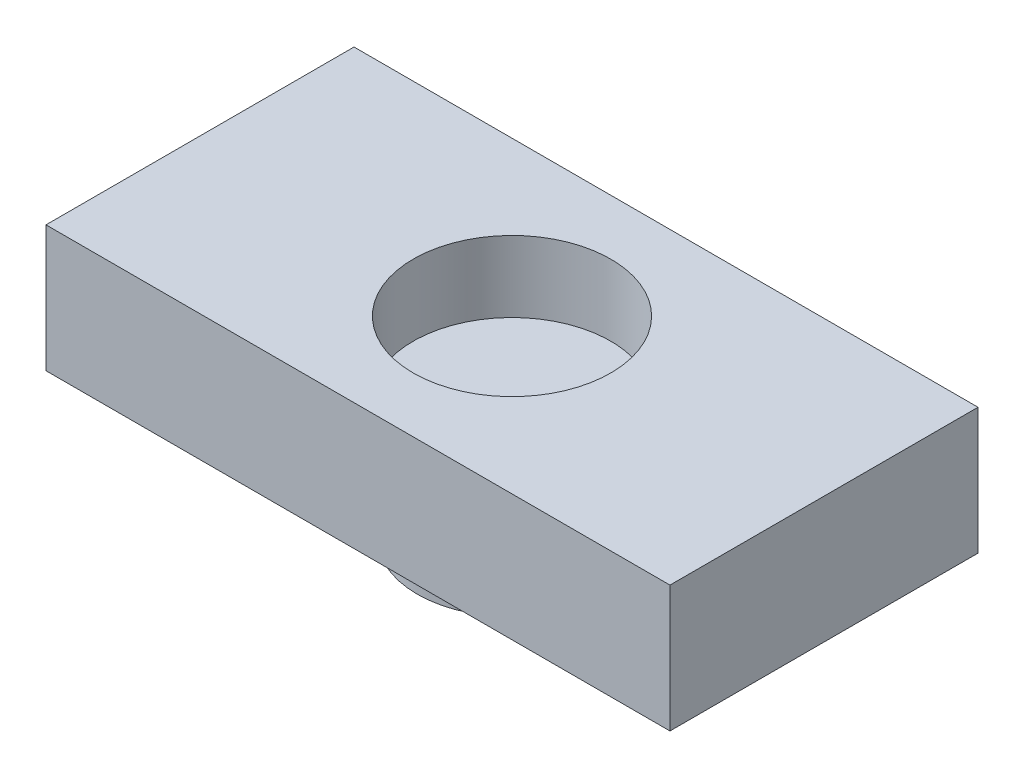
ISO-10303-21;
HEADER;
FILE_DESCRIPTION(('STEP AP214'),'2;1');
FILE_NAME('part.step','',(''),(''),'','','');
FILE_SCHEMA(('AUTOMOTIVE_DESIGN { 1 0 10303 214 1 1 1 1 }'));
ENDSEC;
DATA;
#1=APPLICATION_CONTEXT('core data for automotive mechanical design processes');
#2=APPLICATION_PROTOCOL_DEFINITION('international standard','automotive_design',2000,#1);
#3=PRODUCT_CONTEXT('',#1,'mechanical');
#4=PRODUCT('Part','Part','',(#3));
#5=PRODUCT_RELATED_PRODUCT_CATEGORY('part','',(#4));
#6=PRODUCT_DEFINITION_FORMATION('','',#4);
#7=PRODUCT_DEFINITION_CONTEXT('part definition',#1,'design');
#8=PRODUCT_DEFINITION('design','',#6,#7);
#9=PRODUCT_DEFINITION_SHAPE('','',#8);
#10=(LENGTH_UNIT() NAMED_UNIT(*) SI_UNIT(.MILLI.,.METRE.));
#11=(NAMED_UNIT(*) PLANE_ANGLE_UNIT() SI_UNIT($,.RADIAN.));
#12=(NAMED_UNIT(*) SI_UNIT($,.STERADIAN.) SOLID_ANGLE_UNIT());
#13=UNCERTAINTY_MEASURE_WITH_UNIT(LENGTH_MEASURE(1.E-05),#10,'distance_accuracy_value','');
#14=(GEOMETRIC_REPRESENTATION_CONTEXT(3) GLOBAL_UNCERTAINTY_ASSIGNED_CONTEXT((#13)) GLOBAL_UNIT_ASSIGNED_CONTEXT((#10,
#11,#12)) REPRESENTATION_CONTEXT('',''));
#15=CARTESIAN_POINT('',(0.,0.,0.));
#16=DIRECTION('',(0.,0.,1.));
#17=DIRECTION('',(1.,0.,0.));
#18=AXIS2_PLACEMENT_3D('',#15,#16,#17);
#19=CARTESIAN_POINT('',(-7.9,3.2,0.));
#20=DIRECTION('',(-1.,0.,0.));
#21=DIRECTION('',(0.,0.,1.));
#22=AXIS2_PLACEMENT_3D('',#19,#20,#21);
#23=PLANE('',#22);
#24=DIRECTION('',(0.,0.,-1.));
#25=VECTOR('',#24,1.);
#26=CARTESIAN_POINT('',(-7.9,0.,0.));
#27=LINE('',#26,#25);
#28=CARTESIAN_POINT('',(-7.9,0.,3.9));
#29=VERTEX_POINT('',#28);
#30=CARTESIAN_POINT('',(-7.9,0.,-3.9));
#31=VERTEX_POINT('',#30);
#32=EDGE_CURVE('E156',#29,#31,#27,.T.);
#33=ORIENTED_EDGE('',*,*,#32,.F.);
#34=DIRECTION('',(0.,-1.,0.));
#35=VECTOR('',#34,1.);
#36=CARTESIAN_POINT('',(-7.9,3.2,3.9));
#37=LINE('',#36,#35);
#38=CARTESIAN_POINT('',(-7.9,3.2,3.9));
#39=VERTEX_POINT('',#38);
#40=EDGE_CURVE('E97',#39,#29,#37,.T.);
#41=ORIENTED_EDGE('',*,*,#40,.F.);
#42=DIRECTION('',(0.,0.,-1.));
#43=VECTOR('',#42,1.);
#44=CARTESIAN_POINT('',(-7.9,3.2,0.));
#45=LINE('',#44,#43);
#46=CARTESIAN_POINT('',(-7.9,3.2,-3.9));
#47=VERTEX_POINT('',#46);
#48=EDGE_CURVE('E149',#39,#47,#45,.T.);
#49=ORIENTED_EDGE('',*,*,#48,.T.);
#50=DIRECTION('',(0.,-1.,0.));
#51=VECTOR('',#50,1.);
#52=CARTESIAN_POINT('',(-7.9,3.2,-3.9));
#53=LINE('',#52,#51);
#54=EDGE_CURVE('E128',#47,#31,#53,.T.);
#55=ORIENTED_EDGE('',*,*,#54,.T.);
#56=EDGE_LOOP('',(#33,#41,#49,#55));
#57=FACE_BOUND('',#56,.T.);
#58=ADVANCED_FACE('F89',(#57),#23,.T.);
#59=CARTESIAN_POINT('',(0.,0.,0.));
#60=DIRECTION('',(0.,1.,0.));
#61=DIRECTION('',(0.,0.,1.));
#62=AXIS2_PLACEMENT_3D('',#59,#60,#61);
#63=PLANE('',#62);
#64=CARTESIAN_POINT('',(0.,0.,0.));
#65=DIRECTION('',(0.,1.,0.));
#66=DIRECTION('',(0.,0.,1.));
#67=AXIS2_PLACEMENT_3D('',#64,#65,#66);
#68=CIRCLE('',#67,2.4);
#69=CARTESIAN_POINT('',(0.,0.,2.4));
#70=VERTEX_POINT('',#69);
#71=EDGE_CURVE('E220',#70,#70,#68,.T.);
#72=ORIENTED_EDGE('',*,*,#71,.T.);
#73=EDGE_LOOP('',(#72));
#74=FACE_BOUND('',#73,.T.);
#75=ORIENTED_EDGE('',*,*,#32,.T.);
#76=DIRECTION('',(-1.,0.,0.));
#77=VECTOR('',#76,1.);
#78=CARTESIAN_POINT('',(0.,0.,-3.9));
#79=LINE('',#78,#77);
#80=CARTESIAN_POINT('',(7.9,0.,-3.9));
#81=VERTEX_POINT('',#80);
#82=EDGE_CURVE('E151',#81,#31,#79,.T.);
#83=ORIENTED_EDGE('',*,*,#82,.F.);
#84=DIRECTION('',(0.,0.,-1.));
#85=VECTOR('',#84,1.);
#86=CARTESIAN_POINT('',(7.9,0.,0.));
#87=LINE('',#86,#85);
#88=CARTESIAN_POINT('',(7.9,0.,3.9));
#89=VERTEX_POINT('',#88);
#90=EDGE_CURVE('E121',#89,#81,#87,.T.);
#91=ORIENTED_EDGE('',*,*,#90,.F.);
#92=DIRECTION('',(-1.,0.,0.));
#93=VECTOR('',#92,1.);
#94=CARTESIAN_POINT('',(0.,0.,3.9));
#95=LINE('',#94,#93);
#96=EDGE_CURVE('E142',#89,#29,#95,.T.);
#97=ORIENTED_EDGE('',*,*,#96,.T.);
#98=EDGE_LOOP('',(#75,#83,#91,#97));
#99=FACE_BOUND('',#98,.T.);
#100=ADVANCED_FACE('F166',(#74,#99),#63,.F.);
#101=CARTESIAN_POINT('',(0.,3.2,3.9));
#102=DIRECTION('',(0.,0.,1.));
#103=DIRECTION('',(1.,0.,0.));
#104=AXIS2_PLACEMENT_3D('',#101,#102,#103);
#105=PLANE('',#104);
#106=ORIENTED_EDGE('',*,*,#96,.F.);
#107=DIRECTION('',(0.,-1.,0.));
#108=VECTOR('',#107,1.);
#109=CARTESIAN_POINT('',(7.9,3.2,3.9));
#110=LINE('',#109,#108);
#111=CARTESIAN_POINT('',(7.9,3.2,3.9));
#112=VERTEX_POINT('',#111);
#113=EDGE_CURVE('E136',#112,#89,#110,.T.);
#114=ORIENTED_EDGE('',*,*,#113,.F.);
#115=DIRECTION('',(-1.,0.,0.));
#116=VECTOR('',#115,1.);
#117=CARTESIAN_POINT('',(0.,3.2,3.9));
#118=LINE('',#117,#116);
#119=EDGE_CURVE('E140',#112,#39,#118,.T.);
#120=ORIENTED_EDGE('',*,*,#119,.T.);
#121=ORIENTED_EDGE('',*,*,#40,.T.);
#122=EDGE_LOOP('',(#106,#114,#120,#121));
#123=FACE_BOUND('',#122,.T.);
#124=ADVANCED_FACE('F138',(#123),#105,.T.);
#125=CARTESIAN_POINT('',(7.9,3.2,0.));
#126=DIRECTION('',(-1.,0.,0.));
#127=DIRECTION('',(0.,0.,1.));
#128=AXIS2_PLACEMENT_3D('',#125,#126,#127);
#129=PLANE('',#128);
#130=ORIENTED_EDGE('',*,*,#90,.T.);
#131=DIRECTION('',(0.,-1.,0.));
#132=VECTOR('',#131,1.);
#133=CARTESIAN_POINT('',(7.9,3.2,-3.9));
#134=LINE('',#133,#132);
#135=CARTESIAN_POINT('',(7.9,3.2,-3.9));
#136=VERTEX_POINT('',#135);
#137=EDGE_CURVE('E143',#136,#81,#134,.T.);
#138=ORIENTED_EDGE('',*,*,#137,.F.);
#139=DIRECTION('',(0.,0.,-1.));
#140=VECTOR('',#139,1.);
#141=CARTESIAN_POINT('',(7.9,3.2,0.));
#142=LINE('',#141,#140);
#143=EDGE_CURVE('E145',#112,#136,#142,.T.);
#144=ORIENTED_EDGE('',*,*,#143,.F.);
#145=ORIENTED_EDGE('',*,*,#113,.T.);
#146=EDGE_LOOP('',(#130,#138,#144,#145));
#147=FACE_BOUND('',#146,.T.);
#148=ADVANCED_FACE('F146',(#147),#129,.F.);
#149=CARTESIAN_POINT('',(0.,3.2,-3.9));
#150=DIRECTION('',(0.,0.,1.));
#151=DIRECTION('',(1.,0.,0.));
#152=AXIS2_PLACEMENT_3D('',#149,#150,#151);
#153=PLANE('',#152);
#154=ORIENTED_EDGE('',*,*,#82,.T.);
#155=ORIENTED_EDGE('',*,*,#54,.F.);
#156=DIRECTION('',(-1.,0.,0.));
#157=VECTOR('',#156,1.);
#158=CARTESIAN_POINT('',(0.,3.2,-3.9));
#159=LINE('',#158,#157);
#160=EDGE_CURVE('E105',#136,#47,#159,.T.);
#161=ORIENTED_EDGE('',*,*,#160,.F.);
#162=ORIENTED_EDGE('',*,*,#137,.T.);
#163=EDGE_LOOP('',(#154,#155,#161,#162));
#164=FACE_BOUND('',#163,.T.);
#165=ADVANCED_FACE('F168',(#164),#153,.F.);
#166=CARTESIAN_POINT('',(0.,3.2,0.));
#167=DIRECTION('',(0.,1.,0.));
#168=DIRECTION('',(0.,0.,1.));
#169=AXIS2_PLACEMENT_3D('',#166,#167,#168);
#170=PLANE('',#169);
#171=CARTESIAN_POINT('',(0.,3.2,0.));
#172=DIRECTION('',(0.,1.,0.));
#173=DIRECTION('',(0.,0.,1.));
#174=AXIS2_PLACEMENT_3D('',#171,#172,#173);
#175=CIRCLE('',#174,2.5);
#176=CARTESIAN_POINT('',(0.,3.2,2.5));
#177=VERTEX_POINT('',#176);
#178=EDGE_CURVE('E227',#177,#177,#175,.T.);
#179=ORIENTED_EDGE('',*,*,#178,.F.);
#180=EDGE_LOOP('',(#179));
#181=FACE_BOUND('',#180,.T.);
#182=ORIENTED_EDGE('',*,*,#48,.F.);
#183=ORIENTED_EDGE('',*,*,#119,.F.);
#184=ORIENTED_EDGE('',*,*,#143,.T.);
#185=ORIENTED_EDGE('',*,*,#160,.T.);
#186=EDGE_LOOP('',(#182,#183,#184,#185));
#187=FACE_BOUND('',#186,.T.);
#188=ADVANCED_FACE('F148',(#181,#187),#170,.T.);
#189=CARTESIAN_POINT('',(0.,-1.7,0.));
#190=DIRECTION('',(0.,1.,0.));
#191=DIRECTION('',(0.,0.,1.));
#192=AXIS2_PLACEMENT_3D('',#189,#190,#191);
#193=CYLINDRICAL_SURFACE('',#192,2.4);
#194=CARTESIAN_POINT('',(0.,-1.7,0.));
#195=DIRECTION('',(0.,1.,0.));
#196=DIRECTION('',(0.,0.,1.));
#197=AXIS2_PLACEMENT_3D('',#194,#195,#196);
#198=CIRCLE('',#197,2.4);
#199=CARTESIAN_POINT('',(0.,-1.7,2.4));
#200=VERTEX_POINT('',#199);
#201=EDGE_CURVE('E159',#200,#200,#198,.T.);
#202=ORIENTED_EDGE('',*,*,#201,.T.);
#203=EDGE_LOOP('',(#202));
#204=FACE_BOUND('',#203,.T.);
#205=ORIENTED_EDGE('',*,*,#71,.F.);
#206=EDGE_LOOP('',(#205));
#207=FACE_BOUND('',#206,.T.);
#208=ADVANCED_FACE('F175',(#204,#207),#193,.T.);
#209=CARTESIAN_POINT('',(0.,-1.7,0.));
#210=DIRECTION('',(0.,1.,0.));
#211=DIRECTION('',(0.,0.,1.));
#212=AXIS2_PLACEMENT_3D('',#209,#210,#211);
#213=PLANE('',#212);
#214=CARTESIAN_POINT('',(0.,-1.7,0.));
#215=DIRECTION('',(0.,1.,0.));
#216=DIRECTION('',(0.,0.,1.));
#217=AXIS2_PLACEMENT_3D('',#214,#215,#216);
#218=CIRCLE('',#217,1.6);
#219=CARTESIAN_POINT('',(0.,-1.7,1.6));
#220=VERTEX_POINT('',#219);
#221=EDGE_CURVE('E221',#220,#220,#218,.T.);
#222=ORIENTED_EDGE('',*,*,#221,.T.);
#223=EDGE_LOOP('',(#222));
#224=FACE_BOUND('',#223,.T.);
#225=ORIENTED_EDGE('',*,*,#201,.F.);
#226=EDGE_LOOP('',(#225));
#227=FACE_BOUND('',#226,.T.);
#228=ADVANCED_FACE('F199',(#224,#227),#213,.F.);
#229=CARTESIAN_POINT('',(0.,-1.7,0.));
#230=DIRECTION('',(0.,1.,0.));
#231=DIRECTION('',(0.,0.,1.));
#232=AXIS2_PLACEMENT_3D('',#229,#230,#231);
#233=CYLINDRICAL_SURFACE('',#232,1.6);
#234=ORIENTED_EDGE('',*,*,#221,.F.);
#235=EDGE_LOOP('',(#234));
#236=FACE_BOUND('',#235,.T.);
#237=CARTESIAN_POINT('',(0.,0.,0.));
#238=DIRECTION('',(0.,1.,0.));
#239=DIRECTION('',(0.,0.,1.));
#240=AXIS2_PLACEMENT_3D('',#237,#238,#239);
#241=CIRCLE('',#240,1.6);
#242=CARTESIAN_POINT('',(0.,0.,1.6));
#243=VERTEX_POINT('',#242);
#244=EDGE_CURVE('E12',#243,#243,#241,.T.);
#245=ORIENTED_EDGE('',*,*,#244,.T.);
#246=EDGE_LOOP('',(#245));
#247=FACE_BOUND('',#246,.T.);
#248=ADVANCED_FACE('F190',(#236,#247),#233,.F.);
#249=ORIENTED_EDGE('',*,*,#244,.F.);
#250=EDGE_LOOP('',(#249));
#251=FACE_BOUND('',#250,.T.);
#252=ADVANCED_FACE('F182',(#251),#63,.F.);
#253=CARTESIAN_POINT('',(0.,1.4,0.));
#254=DIRECTION('',(0.,1.,0.));
#255=DIRECTION('',(0.,0.,1.));
#256=AXIS2_PLACEMENT_3D('',#253,#254,#255);
#257=CYLINDRICAL_SURFACE('',#256,2.5);
#258=CARTESIAN_POINT('',(0.,1.4,0.));
#259=DIRECTION('',(0.,1.,0.));
#260=DIRECTION('',(0.,0.,1.));
#261=AXIS2_PLACEMENT_3D('',#258,#259,#260);
#262=CIRCLE('',#261,2.5);
#263=CARTESIAN_POINT('',(0.,1.4,2.5));
#264=VERTEX_POINT('',#263);
#265=EDGE_CURVE('E224',#264,#264,#262,.T.);
#266=ORIENTED_EDGE('',*,*,#265,.F.);
#267=EDGE_LOOP('',(#266));
#268=FACE_BOUND('',#267,.T.);
#269=ORIENTED_EDGE('',*,*,#178,.T.);
#270=EDGE_LOOP('',(#269));
#271=FACE_BOUND('',#270,.T.);
#272=ADVANCED_FACE('F189',(#268,#271),#257,.F.);
#273=CARTESIAN_POINT('',(0.,1.4,0.));
#274=DIRECTION('',(0.,1.,0.));
#275=DIRECTION('',(0.,0.,1.));
#276=AXIS2_PLACEMENT_3D('',#273,#274,#275);
#277=PLANE('',#276);
#278=ORIENTED_EDGE('',*,*,#265,.T.);
#279=EDGE_LOOP('',(#278));
#280=FACE_BOUND('',#279,.T.);
#281=ADVANCED_FACE('F196',(#280),#277,.T.);
#282=CLOSED_SHELL('',(#58,#100,#124,#148,#165,#188,#208,#228,#248,#252,#272,#281));
#283=MANIFOLD_SOLID_BREP('B2',#282);
#284=ADVANCED_BREP_SHAPE_REPRESENTATION('',(#18,#283),#14);
#285=SHAPE_DEFINITION_REPRESENTATION(#9,#284);
ENDSEC;
END-ISO-10303-21;
